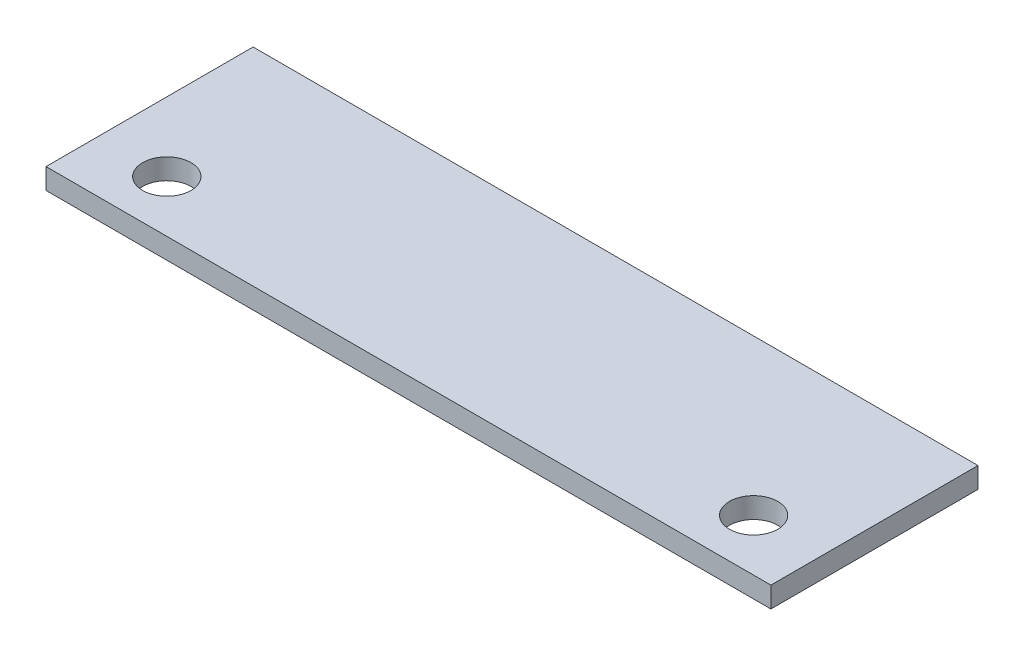
ISO-10303-21;
HEADER;
FILE_DESCRIPTION(('STEP AP214'),'2;1');
FILE_NAME('part.step','',(''),(''),'','','');
FILE_SCHEMA(('AUTOMOTIVE_DESIGN { 1 0 10303 214 1 1 1 1 }'));
ENDSEC;
DATA;
#1=APPLICATION_CONTEXT('core data for automotive mechanical design processes');
#2=APPLICATION_PROTOCOL_DEFINITION('international standard','automotive_design',2000,#1);
#3=PRODUCT_CONTEXT('',#1,'mechanical');
#4=PRODUCT('Part','Part','',(#3));
#5=PRODUCT_RELATED_PRODUCT_CATEGORY('part','',(#4));
#6=PRODUCT_DEFINITION_FORMATION('','',#4);
#7=PRODUCT_DEFINITION_CONTEXT('part definition',#1,'design');
#8=PRODUCT_DEFINITION('design','',#6,#7);
#9=PRODUCT_DEFINITION_SHAPE('','',#8);
#10=(LENGTH_UNIT() NAMED_UNIT(*) SI_UNIT(.MILLI.,.METRE.));
#11=(NAMED_UNIT(*) PLANE_ANGLE_UNIT() SI_UNIT($,.RADIAN.));
#12=(NAMED_UNIT(*) SI_UNIT($,.STERADIAN.) SOLID_ANGLE_UNIT());
#13=UNCERTAINTY_MEASURE_WITH_UNIT(LENGTH_MEASURE(1.E-05),#10,'distance_accuracy_value','');
#14=(GEOMETRIC_REPRESENTATION_CONTEXT(3) GLOBAL_UNCERTAINTY_ASSIGNED_CONTEXT((#13)) GLOBAL_UNIT_ASSIGNED_CONTEXT((#10,
#11,#12)) REPRESENTATION_CONTEXT('',''));
#15=CARTESIAN_POINT('',(0.,0.,0.));
#16=DIRECTION('',(0.,0.,1.));
#17=DIRECTION('',(1.,0.,0.));
#18=AXIS2_PLACEMENT_3D('',#15,#16,#17);
#19=CARTESIAN_POINT('',(105.,6.,30.));
#20=DIRECTION('',(-1.,0.,0.));
#21=DIRECTION('',(0.,0.,1.));
#22=AXIS2_PLACEMENT_3D('',#19,#20,#21);
#23=PLANE('',#22);
#24=DIRECTION('',(0.,0.,-1.));
#25=VECTOR('',#24,1.);
#26=CARTESIAN_POINT('',(105.,0.,30.));
#27=LINE('',#26,#25);
#28=CARTESIAN_POINT('',(105.,0.,30.));
#29=VERTEX_POINT('',#28);
#30=CARTESIAN_POINT('',(105.,0.,-30.));
#31=VERTEX_POINT('',#30);
#32=EDGE_CURVE('E98',#29,#31,#27,.T.);
#33=ORIENTED_EDGE('',*,*,#32,.T.);
#34=DIRECTION('',(0.,-1.,0.));
#35=VECTOR('',#34,1.);
#36=CARTESIAN_POINT('',(105.,6.,-30.));
#37=LINE('',#36,#35);
#38=CARTESIAN_POINT('',(105.,6.,-30.));
#39=VERTEX_POINT('',#38);
#40=EDGE_CURVE('E11',#39,#31,#37,.T.);
#41=ORIENTED_EDGE('',*,*,#40,.F.);
#42=DIRECTION('',(0.,0.,-1.));
#43=VECTOR('',#42,1.);
#44=CARTESIAN_POINT('',(105.,6.,30.));
#45=LINE('',#44,#43);
#46=CARTESIAN_POINT('',(105.,6.,30.));
#47=VERTEX_POINT('',#46);
#48=EDGE_CURVE('E86',#47,#39,#45,.T.);
#49=ORIENTED_EDGE('',*,*,#48,.F.);
#50=DIRECTION('',(0.,-1.,0.));
#51=VECTOR('',#50,1.);
#52=CARTESIAN_POINT('',(105.,6.,30.));
#53=LINE('',#52,#51);
#54=EDGE_CURVE('E94',#47,#29,#53,.T.);
#55=ORIENTED_EDGE('',*,*,#54,.T.);
#56=EDGE_LOOP('',(#33,#41,#49,#55));
#57=FACE_BOUND('',#56,.T.);
#58=ADVANCED_FACE('F35',(#57),#23,.F.);
#59=CARTESIAN_POINT('',(-105.,6.,-30.));
#60=DIRECTION('',(0.,0.,1.));
#61=DIRECTION('',(1.,0.,0.));
#62=AXIS2_PLACEMENT_3D('',#59,#60,#61);
#63=PLANE('',#62);
#64=DIRECTION('',(-1.,0.,0.));
#65=VECTOR('',#64,1.);
#66=CARTESIAN_POINT('',(-105.,0.,-30.));
#67=LINE('',#66,#65);
#68=CARTESIAN_POINT('',(-105.,0.,-30.));
#69=VERTEX_POINT('',#68);
#70=EDGE_CURVE('E90',#31,#69,#67,.T.);
#71=ORIENTED_EDGE('',*,*,#70,.T.);
#72=DIRECTION('',(0.,-1.,0.));
#73=VECTOR('',#72,1.);
#74=CARTESIAN_POINT('',(-105.,6.,-30.));
#75=LINE('',#74,#73);
#76=CARTESIAN_POINT('',(-105.,6.,-30.));
#77=VERTEX_POINT('',#76);
#78=EDGE_CURVE('E43',#77,#69,#75,.T.);
#79=ORIENTED_EDGE('',*,*,#78,.F.);
#80=DIRECTION('',(-1.,0.,0.));
#81=VECTOR('',#80,1.);
#82=CARTESIAN_POINT('',(-105.,6.,-30.));
#83=LINE('',#82,#81);
#84=EDGE_CURVE('E81',#39,#77,#83,.T.);
#85=ORIENTED_EDGE('',*,*,#84,.F.);
#86=ORIENTED_EDGE('',*,*,#40,.T.);
#87=EDGE_LOOP('',(#71,#79,#85,#86));
#88=FACE_BOUND('',#87,.T.);
#89=ADVANCED_FACE('F89',(#88),#63,.F.);
#90=CARTESIAN_POINT('',(-105.,6.,30.));
#91=DIRECTION('',(1.,0.,0.));
#92=DIRECTION('',(0.,0.,-1.));
#93=AXIS2_PLACEMENT_3D('',#90,#91,#92);
#94=PLANE('',#93);
#95=DIRECTION('',(0.,0.,1.));
#96=VECTOR('',#95,1.);
#97=CARTESIAN_POINT('',(-105.,0.,30.));
#98=LINE('',#97,#96);
#99=CARTESIAN_POINT('',(-105.,0.,30.));
#100=VERTEX_POINT('',#99);
#101=EDGE_CURVE('E68',#69,#100,#98,.T.);
#102=ORIENTED_EDGE('',*,*,#101,.T.);
#103=DIRECTION('',(0.,-1.,0.));
#104=VECTOR('',#103,1.);
#105=CARTESIAN_POINT('',(-105.,6.,30.));
#106=LINE('',#105,#104);
#107=CARTESIAN_POINT('',(-105.,6.,30.));
#108=VERTEX_POINT('',#107);
#109=EDGE_CURVE('E91',#108,#100,#106,.T.);
#110=ORIENTED_EDGE('',*,*,#109,.F.);
#111=DIRECTION('',(0.,0.,1.));
#112=VECTOR('',#111,1.);
#113=CARTESIAN_POINT('',(-105.,6.,30.));
#114=LINE('',#113,#112);
#115=EDGE_CURVE('E84',#77,#108,#114,.T.);
#116=ORIENTED_EDGE('',*,*,#115,.F.);
#117=ORIENTED_EDGE('',*,*,#78,.T.);
#118=EDGE_LOOP('',(#102,#110,#116,#117));
#119=FACE_BOUND('',#118,.T.);
#120=ADVANCED_FACE('F92',(#119),#94,.F.);
#121=CARTESIAN_POINT('',(-105.,6.,30.));
#122=DIRECTION('',(0.,0.,-1.));
#123=DIRECTION('',(-1.,0.,0.));
#124=AXIS2_PLACEMENT_3D('',#121,#122,#123);
#125=PLANE('',#124);
#126=DIRECTION('',(1.,0.,0.));
#127=VECTOR('',#126,1.);
#128=CARTESIAN_POINT('',(-105.,0.,30.));
#129=LINE('',#128,#127);
#130=EDGE_CURVE('E74',#100,#29,#129,.T.);
#131=ORIENTED_EDGE('',*,*,#130,.T.);
#132=ORIENTED_EDGE('',*,*,#54,.F.);
#133=DIRECTION('',(1.,0.,0.));
#134=VECTOR('',#133,1.);
#135=CARTESIAN_POINT('',(-105.,6.,30.));
#136=LINE('',#135,#134);
#137=EDGE_CURVE('E51',#108,#47,#136,.T.);
#138=ORIENTED_EDGE('',*,*,#137,.F.);
#139=ORIENTED_EDGE('',*,*,#109,.T.);
#140=EDGE_LOOP('',(#131,#132,#138,#139));
#141=FACE_BOUND('',#140,.T.);
#142=ADVANCED_FACE('F106',(#141),#125,.F.);
#143=CARTESIAN_POINT('',(0.,6.,0.));
#144=DIRECTION('',(0.,-1.,0.));
#145=DIRECTION('',(0.,0.,-1.));
#146=AXIS2_PLACEMENT_3D('',#143,#144,#145);
#147=PLANE('',#146);
#148=CARTESIAN_POINT('',(85.,6.,15.));
#149=DIRECTION('',(0.,-1.,0.));
#150=DIRECTION('',(0.,0.,-1.));
#151=AXIS2_PLACEMENT_3D('',#148,#149,#150);
#152=CIRCLE('',#151,7.);
#153=CARTESIAN_POINT('',(85.,6.,8.));
#154=VERTEX_POINT('',#153);
#155=EDGE_CURVE('E101',#154,#154,#152,.T.);
#156=ORIENTED_EDGE('',*,*,#155,.T.);
#157=EDGE_LOOP('',(#156));
#158=FACE_BOUND('',#157,.T.);
#159=CARTESIAN_POINT('',(-85.,6.,15.));
#160=DIRECTION('',(0.,-1.,0.));
#161=DIRECTION('',(0.,0.,-1.));
#162=AXIS2_PLACEMENT_3D('',#159,#160,#161);
#163=CIRCLE('',#162,7.);
#164=CARTESIAN_POINT('',(-85.,6.,8.));
#165=VERTEX_POINT('',#164);
#166=EDGE_CURVE('E114',#165,#165,#163,.T.);
#167=ORIENTED_EDGE('',*,*,#166,.T.);
#168=EDGE_LOOP('',(#167));
#169=FACE_BOUND('',#168,.T.);
#170=ORIENTED_EDGE('',*,*,#48,.T.);
#171=ORIENTED_EDGE('',*,*,#84,.T.);
#172=ORIENTED_EDGE('',*,*,#115,.T.);
#173=ORIENTED_EDGE('',*,*,#137,.T.);
#174=EDGE_LOOP('',(#170,#171,#172,#173));
#175=FACE_BOUND('',#174,.T.);
#176=ADVANCED_FACE('F82',(#158,#169,#175),#147,.F.);
#177=CARTESIAN_POINT('',(0.,0.,0.));
#178=DIRECTION('',(0.,-1.,0.));
#179=DIRECTION('',(0.,0.,-1.));
#180=AXIS2_PLACEMENT_3D('',#177,#178,#179);
#181=PLANE('',#180);
#182=CARTESIAN_POINT('',(85.,0.,15.));
#183=DIRECTION('',(0.,1.,0.));
#184=DIRECTION('',(0.,0.,1.));
#185=AXIS2_PLACEMENT_3D('',#182,#183,#184);
#186=CIRCLE('',#185,7.);
#187=CARTESIAN_POINT('',(85.,0.,22.));
#188=VERTEX_POINT('',#187);
#189=EDGE_CURVE('E117',#188,#188,#186,.T.);
#190=ORIENTED_EDGE('',*,*,#189,.T.);
#191=EDGE_LOOP('',(#190));
#192=FACE_BOUND('',#191,.T.);
#193=CARTESIAN_POINT('',(-85.,0.,15.));
#194=DIRECTION('',(0.,1.,0.));
#195=DIRECTION('',(0.,0.,1.));
#196=AXIS2_PLACEMENT_3D('',#193,#194,#195);
#197=CIRCLE('',#196,7.);
#198=CARTESIAN_POINT('',(-85.,0.,22.));
#199=VERTEX_POINT('',#198);
#200=EDGE_CURVE('E118',#199,#199,#197,.T.);
#201=ORIENTED_EDGE('',*,*,#200,.T.);
#202=EDGE_LOOP('',(#201));
#203=FACE_BOUND('',#202,.T.);
#204=ORIENTED_EDGE('',*,*,#32,.F.);
#205=ORIENTED_EDGE('',*,*,#130,.F.);
#206=ORIENTED_EDGE('',*,*,#101,.F.);
#207=ORIENTED_EDGE('',*,*,#70,.F.);
#208=EDGE_LOOP('',(#204,#205,#206,#207));
#209=FACE_BOUND('',#208,.T.);
#210=ADVANCED_FACE('F109',(#192,#203,#209),#181,.T.);
#211=CARTESIAN_POINT('',(-85.,0.,15.));
#212=DIRECTION('',(0.,1.,0.));
#213=DIRECTION('',(0.,0.,1.));
#214=AXIS2_PLACEMENT_3D('',#211,#212,#213);
#215=CYLINDRICAL_SURFACE('',#214,7.);
#216=ORIENTED_EDGE('',*,*,#200,.F.);
#217=EDGE_LOOP('',(#216));
#218=FACE_BOUND('',#217,.T.);
#219=ORIENTED_EDGE('',*,*,#166,.F.);
#220=EDGE_LOOP('',(#219));
#221=FACE_BOUND('',#220,.T.);
#222=ADVANCED_FACE('F129',(#218,#221),#215,.F.);
#223=CARTESIAN_POINT('',(85.,0.,15.));
#224=DIRECTION('',(0.,1.,0.));
#225=DIRECTION('',(0.,0.,1.));
#226=AXIS2_PLACEMENT_3D('',#223,#224,#225);
#227=CYLINDRICAL_SURFACE('',#226,7.);
#228=ORIENTED_EDGE('',*,*,#189,.F.);
#229=EDGE_LOOP('',(#228));
#230=FACE_BOUND('',#229,.T.);
#231=ORIENTED_EDGE('',*,*,#155,.F.);
#232=EDGE_LOOP('',(#231));
#233=FACE_BOUND('',#232,.T.);
#234=ADVANCED_FACE('F126',(#230,#233),#227,.F.);
#235=CLOSED_SHELL('',(#58,#89,#120,#142,#176,#210,#222,#234));
#236=MANIFOLD_SOLID_BREP('B2',#235);
#237=ADVANCED_BREP_SHAPE_REPRESENTATION('',(#18,#236),#14);
#238=SHAPE_DEFINITION_REPRESENTATION(#9,#237);
ENDSEC;
END-ISO-10303-21;
